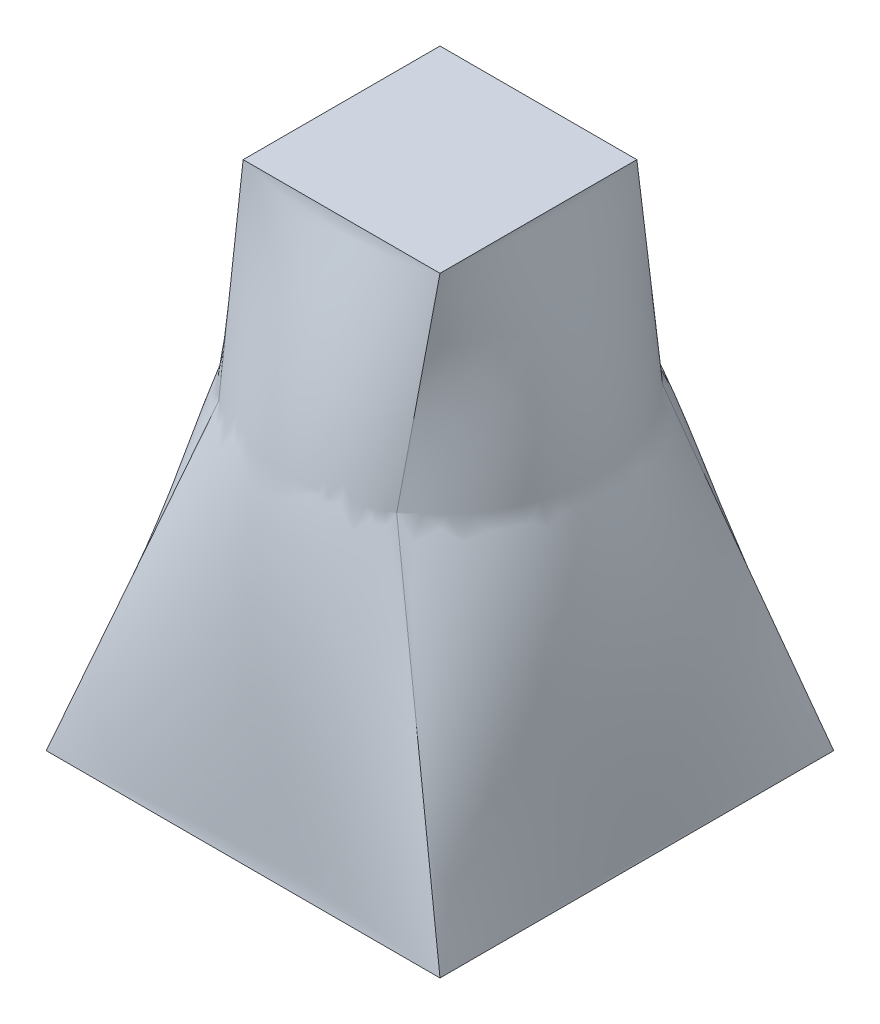
ISO-10303-21;
HEADER;
FILE_DESCRIPTION(('STEP AP214'),'2;1');
FILE_NAME('part.step','',(''),(''),'','','');
FILE_SCHEMA(('AUTOMOTIVE_DESIGN { 1 0 10303 214 1 1 1 1 }'));
ENDSEC;
DATA;
#1=APPLICATION_CONTEXT('core data for automotive mechanical design processes');
#2=APPLICATION_PROTOCOL_DEFINITION('international standard','automotive_design',2000,#1);
#3=PRODUCT_CONTEXT('',#1,'mechanical');
#4=PRODUCT('Part','Part','',(#3));
#5=PRODUCT_RELATED_PRODUCT_CATEGORY('part','',(#4));
#6=PRODUCT_DEFINITION_FORMATION('','',#4);
#7=PRODUCT_DEFINITION_CONTEXT('part definition',#1,'design');
#8=PRODUCT_DEFINITION('design','',#6,#7);
#9=PRODUCT_DEFINITION_SHAPE('','',#8);
#10=(LENGTH_UNIT() NAMED_UNIT(*) SI_UNIT(.MILLI.,.METRE.));
#11=(NAMED_UNIT(*) PLANE_ANGLE_UNIT() SI_UNIT($,.RADIAN.));
#12=(NAMED_UNIT(*) SI_UNIT($,.STERADIAN.) SOLID_ANGLE_UNIT());
#13=UNCERTAINTY_MEASURE_WITH_UNIT(LENGTH_MEASURE(1.E-05),#10,'distance_accuracy_value','');
#14=(GEOMETRIC_REPRESENTATION_CONTEXT(3) GLOBAL_UNCERTAINTY_ASSIGNED_CONTEXT((#13)) GLOBAL_UNIT_ASSIGNED_CONTEXT((#10,
#11,#12)) REPRESENTATION_CONTEXT('',''));
#15=CARTESIAN_POINT('',(0.,0.,0.));
#16=DIRECTION('',(0.,0.,1.));
#17=DIRECTION('',(1.,0.,0.));
#18=AXIS2_PLACEMENT_3D('',#15,#16,#17);
#19=CARTESIAN_POINT('',(0.,0.,0.));
#20=DIRECTION('',(0.,-1.,0.));
#21=DIRECTION('',(0.,0.,-1.));
#22=AXIS2_PLACEMENT_3D('',#19,#20,#21);
#23=PLANE('',#22);
#24=DIRECTION('',(0.,0.,-1.));
#25=VECTOR('',#24,1.);
#26=CARTESIAN_POINT('',(50.,0.,50.));
#27=LINE('',#26,#25);
#28=CARTESIAN_POINT('',(50.,0.,50.));
#29=VERTEX_POINT('',#28);
#30=CARTESIAN_POINT('',(50.,0.,-50.));
#31=VERTEX_POINT('',#30);
#32=EDGE_CURVE('E149',#29,#31,#27,.T.);
#33=ORIENTED_EDGE('',*,*,#32,.F.);
#34=DIRECTION('',(1.,0.,0.));
#35=VECTOR('',#34,1.);
#36=CARTESIAN_POINT('',(-50.,0.,50.));
#37=LINE('',#36,#35);
#38=CARTESIAN_POINT('',(-50.,0.,50.));
#39=VERTEX_POINT('',#38);
#40=EDGE_CURVE('E13',#39,#29,#37,.T.);
#41=ORIENTED_EDGE('',*,*,#40,.F.);
#42=DIRECTION('',(0.,0.,1.));
#43=VECTOR('',#42,1.);
#44=CARTESIAN_POINT('',(-50.,0.,50.));
#45=LINE('',#44,#43);
#46=CARTESIAN_POINT('',(-50.,0.,-50.));
#47=VERTEX_POINT('',#46);
#48=EDGE_CURVE('E105',#47,#39,#45,.T.);
#49=ORIENTED_EDGE('',*,*,#48,.F.);
#50=DIRECTION('',(-1.,0.,0.));
#51=VECTOR('',#50,1.);
#52=CARTESIAN_POINT('',(-50.,0.,-50.));
#53=LINE('',#52,#51);
#54=EDGE_CURVE('E236',#31,#47,#53,.T.);
#55=ORIENTED_EDGE('',*,*,#54,.F.);
#56=EDGE_LOOP('',(#33,#41,#49,#55));
#57=FACE_BOUND('',#56,.T.);
#58=ADVANCED_FACE('F95',(#57),#23,.T.);
#59=CARTESIAN_POINT('',(0.,130.,0.));
#60=DIRECTION('',(0.,-1.,0.));
#61=DIRECTION('',(0.,0.,-1.));
#62=AXIS2_PLACEMENT_3D('',#59,#60,#61);
#63=PLANE('',#62);
#64=DIRECTION('',(0.,0.,-1.));
#65=VECTOR('',#64,1.);
#66=CARTESIAN_POINT('',(25.,130.,25.));
#67=LINE('',#66,#65);
#68=CARTESIAN_POINT('',(25.,130.,25.));
#69=VERTEX_POINT('',#68);
#70=CARTESIAN_POINT('',(25.,130.,-25.));
#71=VERTEX_POINT('',#70);
#72=EDGE_CURVE('E205',#69,#71,#67,.T.);
#73=ORIENTED_EDGE('',*,*,#72,.T.);
#74=DIRECTION('',(-1.,0.,0.));
#75=VECTOR('',#74,1.);
#76=CARTESIAN_POINT('',(-25.,130.,-25.));
#77=LINE('',#76,#75);
#78=CARTESIAN_POINT('',(-25.,130.,-25.));
#79=VERTEX_POINT('',#78);
#80=EDGE_CURVE('E163',#71,#79,#77,.T.);
#81=ORIENTED_EDGE('',*,*,#80,.T.);
#82=DIRECTION('',(0.,0.,1.));
#83=VECTOR('',#82,1.);
#84=CARTESIAN_POINT('',(-25.,130.,25.));
#85=LINE('',#84,#83);
#86=CARTESIAN_POINT('',(-25.,130.,25.));
#87=VERTEX_POINT('',#86);
#88=EDGE_CURVE('E144',#79,#87,#85,.T.);
#89=ORIENTED_EDGE('',*,*,#88,.T.);
#90=DIRECTION('',(1.,0.,0.));
#91=VECTOR('',#90,1.);
#92=CARTESIAN_POINT('',(-25.,130.,25.));
#93=LINE('',#92,#91);
#94=EDGE_CURVE('E151',#87,#69,#93,.T.);
#95=ORIENTED_EDGE('',*,*,#94,.T.);
#96=EDGE_LOOP('',(#73,#81,#89,#95));
#97=FACE_BOUND('',#96,.T.);
#98=ADVANCED_FACE('F162',(#97),#63,.F.);
#99=CARTESIAN_POINT('',(-25.,130.,-25.));
#100=CARTESIAN_POINT('',(-28.0166042683851,113.664252779284,-23.5919860350599));
#101=CARTESIAN_POINT('',(-31.0778100362192,97.0870469419716,-22.163636841461));
#102=CARTESIAN_POINT('',(-34.1511796455153,80.4439774885708,-20.7296574906513));
#103=CARTESIAN_POINT('',(-34.2120123463284,80.11540517951,-20.7070794599427));
#104=CARTESIAN_POINT('',(-34.2284967629137,80.024696144484,-20.6895648336112));
#105=CARTESIAN_POINT('',(-34.2366285279132,79.9820326828711,-20.695119223139));
#106=CARTESIAN_POINT('',(-34.25703197565,79.8794658776715,-20.7395814181119));
#107=CARTESIAN_POINT('',(-39.5126417953677,53.2122053471702,-30.5050137605851));
#108=CARTESIAN_POINT('',(-44.7644754863173,26.5647006500737,-40.2674873293382));
#109=CARTESIAN_POINT('',(-50.,0.,-50.));
#110=CARTESIAN_POINT('',(-23.9583333333333,130.,-25.));
#111=CARTESIAN_POINT('',(-27.1076216989749,113.664479011953,-24.1259920952111));
#112=CARTESIAN_POINT('',(-30.3034720850671,97.0875034653149,-23.2395375640133));
#113=CARTESIAN_POINT('',(-33.3651373223449,80.4439898693503,-22.0251369510696));
#114=CARTESIAN_POINT('',(-33.4256290844794,80.115408969398,-22.0067106372098));
#115=CARTESIAN_POINT('',(-33.4421244169542,80.0246965581231,-21.9904558283137));
#116=CARTESIAN_POINT('',(-33.4501268156366,79.9820327795757,-21.9964510739931));
#117=CARTESIAN_POINT('',(-33.4699157785477,79.8794680806787,-22.0416307972931));
#118=CARTESIAN_POINT('',(-38.5814454653876,53.2126139639133,-32.0096138867381));
#119=CARTESIAN_POINT('',(-43.2562774470771,26.5649172826445,-41.0186563154116));
#120=CARTESIAN_POINT('',(-47.9166666666667,0.,-50.));
#121=CARTESIAN_POINT('',(-21.875,130.,-25.));
#122=CARTESIAN_POINT('',(-25.2314242719928,113.664931477289,-25.1487230997857));
#123=CARTESIAN_POINT('',(-28.6374706451896,97.0884165120017,-25.300107298801));
#124=CARTESIAN_POINT('',(-31.6558694956606,80.4440146309095,-24.5094229648108));
#125=CARTESIAN_POINT('',(-31.715301116851,80.1154165491741,-24.4990059489074));
#126=CARTESIAN_POINT('',(-31.7317167523513,80.0246973854014,-24.4851918266666));
#127=CARTESIAN_POINT('',(-31.7394106961709,79.982032972985,-24.4920301209101));
#128=CARTESIAN_POINT('',(-31.757846735691,79.8794724866931,-24.5385485150994));
#129=CARTESIAN_POINT('',(-36.5497093351536,53.2134311973995,-34.887133562559));
#130=CARTESIAN_POINT('',(-40.1553413157851,26.5653505477862,-42.4552563947875));
#131=CARTESIAN_POINT('',(-43.75,0.,-50.));
#132=CARTESIAN_POINT('',(-18.75,130.,-25.));
#133=CARTESIAN_POINT('',(-22.2582927896984,113.665610175294,-26.5371182103371));
#134=CARTESIAN_POINT('',(-25.8184494297418,97.0897860820315,-28.0974049210502));
#135=CARTESIAN_POINT('',(-28.7177846687277,80.4440517732478,-27.892609747184));
#136=CARTESIAN_POINT('',(-28.7745943205545,80.115427918838,-27.8932602353651));
#137=CARTESIAN_POINT('',(-28.7906134791045,80.0246986263185,-27.8828531108239));
#138=CARTESIAN_POINT('',(-28.7977091174656,79.9820332630987,-27.8908315693015));
#139=CARTESIAN_POINT('',(-28.8137776736506,79.8794790957143,-27.9390478286035));
#140=CARTESIAN_POINT('',(-33.040201119967,53.2146570476283,-38.7797034668301));
#141=CARTESIAN_POINT('',(-35.2733442877938,26.5660004454986,-44.3986311878221));
#142=CARTESIAN_POINT('',(-37.5,0.,-50.));
#143=CARTESIAN_POINT('',(-15.625,130.,-25.));
#144=CARTESIAN_POINT('',(-19.1398734516706,113.666288873299,-27.7701192448802));
#145=CARTESIAN_POINT('',(-22.7067044296911,97.0911556520617,-30.5816168982234));
#146=CARTESIAN_POINT('',(-25.4374318192941,80.4440889155865,-30.909720350408));
#147=CARTESIAN_POINT('',(-25.4906757451719,80.1154392885021,-30.9204289383994));
#148=CARTESIAN_POINT('',(-25.5060451155018,80.024699867236,-30.9131578799612));
#149=CARTESIAN_POINT('',(-25.512418392898,79.9820335532126,-30.9221438178682));
#150=CARTESIAN_POINT('',(-25.5258102047927,79.8794857047358,-30.9717271691418));
#151=CARTESIAN_POINT('',(-29.1081858995565,53.2158828978576,-42.2203767872308));
#152=CARTESIAN_POINT('',(-30.1804223007405,26.5666503432111,-46.1164090859541));
#153=CARTESIAN_POINT('',(-31.25,0.,-50.));
#154=CARTESIAN_POINT('',(-12.5,130.,-25.));
#155=CARTESIAN_POINT('',(-15.8938306766216,113.666967571303,-28.8377363445149));
#156=CARTESIAN_POINT('',(-19.3378256499432,97.0925252220915,-32.732615812994));
#157=CARTESIAN_POINT('',(-21.8564246502447,80.4441260579249,-33.5372207410738));
#158=CARTESIAN_POINT('',(-21.9052738376004,80.115450658166,-33.5569131327693));
#159=CARTESIAN_POINT('',(-21.9197709065844,80.024701108153,-33.5524897913882));
#160=CARTESIAN_POINT('',(-21.9253128504522,79.9820338433262,-33.5623419939776));
#161=CARTESIAN_POINT('',(-21.9357562577318,79.879492313757,-33.6129403995839));
#162=CARTESIAN_POINT('',(-24.8050330097244,53.2171087480864,-45.1801023319383));
#163=CARTESIAN_POINT('',(-24.9022200774751,26.5673002409235,-47.5940870836234));
#164=CARTESIAN_POINT('',(-25.,0.,-50.));
#165=CARTESIAN_POINT('',(-9.37500000000001,130.,-25.));
#166=CARTESIAN_POINT('',(-12.5301959561381,113.667646269308,-29.7305546947475));
#167=CARTESIAN_POINT('',(-15.7320243887352,97.0938947921219,-34.5314328388481));
#168=CARTESIAN_POINT('',(-17.9983952729544,80.4441632002638,-35.7529315709986));
#169=CARTESIAN_POINT('',(-18.042085871483,80.1154620278304,-35.7804723138167));
#170=CARTESIAN_POINT('',(-18.0555056160319,80.0247023490708,-35.7785919255951));
#171=CARTESIAN_POINT('',(-18.0601158192983,79.9820341334405,-35.7891611391853));
#172=CARTESIAN_POINT('',(-18.0673605147559,79.8794989227788,-35.8404025210318));
#173=CARTESIAN_POINT('',(-20.159914712989,53.218334598316,-47.6315011775286));
#174=CARTESIAN_POINT('',(-19.4533010647605,26.5679501386362,-48.8179970091052));
#175=CARTESIAN_POINT('',(-18.75,0.,-50.));
#176=CARTESIAN_POINT('',(-5.20833333333334,130.,-25.));
#177=CARTESIAN_POINT('',(-7.9210642767422,113.668551199981,-30.673669130415));
#178=CARTESIAN_POINT('',(-10.6738810502141,97.0957208854948,-36.4315790118518));
#179=CARTESIAN_POINT('',(-12.5615655401277,80.4442127233815,-38.1246015919141));
#180=CARTESIAN_POINT('',(-12.5975706908647,80.115477187382,-38.1610003336591));
#181=CARTESIAN_POINT('',(-12.6093373096441,80.0247040036267,-38.1620793613874));
#182=CARTESIAN_POINT('',(-12.6125990697743,79.9820345202585,-38.1733934214719));
#183=CARTESIAN_POINT('',(-12.615314261216,79.8795077348069,-38.224965678753));
#184=CARTESIAN_POINT('',(-13.6049932632497,53.2199690652877,-50.1808385134286));
#185=CARTESIAN_POINT('',(-12.0076415708294,26.5688166689193,-50.0908389298271));
#186=CARTESIAN_POINT('',(-10.4166666666667,0.,-50.));
#187=CARTESIAN_POINT('',(0.,130.,-25.));
#188=CARTESIAN_POINT('',(-1.92069756394995,113.669682363322,-31.3698580251672));
#189=CARTESIAN_POINT('',(-3.86976475581595,97.0980035022117,-37.8342166735386));
#190=CARTESIAN_POINT('',(-5.20260680736506,80.4442746272794,-39.9520383632215));
#191=CARTESIAN_POINT('',(-5.22745297024269,80.1154961368224,-39.9963740681884));
#192=CARTESIAN_POINT('',(-5.23673656568602,80.0247060718225,-40.0003107648782));
#193=CARTESIAN_POINT('',(-5.23810874021499,79.9820350037818,-40.0121437212558));
#194=CARTESIAN_POINT('',(-5.23465341615237,79.8795187498429,-40.0631020847051));
#195=CARTESIAN_POINT('',(-4.71645238841328,53.2220121490032,-51.9637735549037));
#196=CARTESIAN_POINT('',(-2.35366302127788,26.5698998317736,-50.9811145691179));
#197=CARTESIAN_POINT('',(0.,0.,-50.));
#198=CARTESIAN_POINT('',(5.20833333333334,130.,-25.));
#199=CARTESIAN_POINT('',(4.17439078143526,113.670813526663,-31.3398941414861));
#200=CARTESIAN_POINT('',(3.12519525801342,97.1002861189283,-37.7738126485701));
#201=CARTESIAN_POINT('',(2.37949642506661,80.4443365311768,-40.068809957092));
#202=CARTESIAN_POINT('',(2.36642454004685,80.1155150862623,-40.1163657033938));
#203=CARTESIAN_POINT('',(2.35978911634042,80.0247081400178,-40.1218940122121));
#204=CARTESIAN_POINT('',(2.36038740643749,79.9820354873047,-40.1336258319826));
#205=CARTESIAN_POINT('',(2.37021487127068,79.8795297648784,-40.1824246066704));
#206=CARTESIAN_POINT('',(4.44754546191996,53.2240552327182,-51.6350067325034));
#207=CARTESIAN_POINT('',(7.43782981930709,26.5709829946276,-50.8171813463495));
#208=CARTESIAN_POINT('',(10.4166666666667,0.,-50.));
#209=CARTESIAN_POINT('',(9.37500000000001,130.,-25.));
#210=CARTESIAN_POINT('',(8.9656595796473,113.671718457336,-30.8935936706644));
#211=CARTESIAN_POINT('',(8.55030572167626,97.1021122123016,-36.8745865839027));
#212=CARTESIAN_POINT('',(8.24540339333367,80.4443860542948,-39.1673069376576));
#213=CARTESIAN_POINT('',(8.24120007705159,80.1155302458142,-39.2146953623516));
#214=CARTESIAN_POINT('',(8.23653533755503,80.0247097945741,-39.2207606241229));
#215=CARTESIAN_POINT('',(8.23863759041092,79.9820358741231,-39.2320509244053));
#216=CARTESIAN_POINT('',(8.25338225786748,79.8795385769068,-39.2782230542373));
#217=CARTESIAN_POINT('',(11.5321340901212,53.2256896996902,-50.1438306463382));
#218=CARTESIAN_POINT('',(15.1479110306351,26.5718495249109,-50.0729084793842));
#219=CARTESIAN_POINT('',(18.75,0.,-50.));
#220=CARTESIAN_POINT('',(12.5,130.,-25.));
#221=CARTESIAN_POINT('',(12.5165980915677,113.672397155341,-30.3556189796041));
#222=CARTESIAN_POINT('',(12.5334838422444,97.1034817823318,-35.79066332898));
#223=CARTESIAN_POINT('',(12.5446816140207,80.4444231966336,-38.0123664328323));
#224=CARTESIAN_POINT('',(12.5468535690319,80.1155416154785,-38.0583091052415));
#225=CARTESIAN_POINT('',(12.543592720572,80.0247110354916,-38.0644227138579));
#226=CARTESIAN_POINT('',(12.5467866452675,79.9820361642371,-38.0752083280197));
#227=CARTESIAN_POINT('',(12.5651287209766,79.8795451859284,-38.1189778359546));
#228=CARTESIAN_POINT('',(16.7219446020975,53.2269155499195,-48.4343856284144));
#229=CARTESIAN_POINT('',(20.868752595593,26.5724994226235,-49.2196319660043));
#230=CARTESIAN_POINT('',(25.,0.,-50.));
#231=CARTESIAN_POINT('',(15.625,130.,-25.));
#232=CARTESIAN_POINT('',(15.9989705727971,113.673075853346,-29.6184826070773));
#233=CARTESIAN_POINT('',(16.378516156353,97.1048513523616,-34.3054721163713));
#234=CARTESIAN_POINT('',(16.6824325025239,80.4444603389719,-36.3882423577123));
#235=CARTESIAN_POINT('',(16.6905343396203,80.1155529851423,-36.4314455692368));
#236=CARTESIAN_POINT('',(16.6885578364289,80.0247122764087,-36.4372602837112));
#237=CARTESIAN_POINT('',(16.6927848871648,79.9820364543507,-36.4473711555347));
#238=CARTESIAN_POINT('',(16.714578420895,79.8795517949496,-36.4883141043372));
#239=CARTESIAN_POINT('',(21.7123604149015,53.2281414001483,-46.1457648413461));
#240=CARTESIAN_POINT('',(26.490051861275,26.5731493203358,-48.0772179380126));
#241=CARTESIAN_POINT('',(31.25,0.,-50.));
#242=CARTESIAN_POINT('',(18.75,130.,-25.));
#243=CARTESIAN_POINT('',(19.400577961085,113.67375455135,-28.6886674820869));
#244=CARTESIAN_POINT('',(20.0608241770216,97.1062209223917,-32.4320746538395));
#245=CARTESIAN_POINT('',(20.6299176010296,80.4444974813106,-34.3102071470011));
#246=CARTESIAN_POINT('',(20.6434246886931,80.1155643548065,-34.3494193006607));
#247=CARTESIAN_POINT('',(20.6425917157781,80.0247135173261,-34.3545991830771));
#248=CARTESIAN_POINT('',(20.6477829304621,79.9820367444647,-34.363870791859));
#249=CARTESIAN_POINT('',(20.6728560049553,79.8795584039711,-34.4015770439113));
#250=CARTESIAN_POINT('',(26.4679058225153,53.2293672503776,-43.2968210853507));
#251=CARTESIAN_POINT('',(31.994098560758,26.5737992180484,-46.6550781354865));
#252=CARTESIAN_POINT('',(37.5,0.,-50.));
#253=CARTESIAN_POINT('',(21.875,130.,-25.));
#254=CARTESIAN_POINT('',(22.7018162020467,113.674433249355,-27.5712971779671));
#255=CARTESIAN_POINT('',(23.540909950591,97.1075904924218,-30.1807938398089));
#256=CARTESIAN_POINT('',(24.3409538277285,80.4445346236492,-31.7903308756842));
#257=CARTESIAN_POINT('',(24.3592141910002,80.1155757244706,-31.8243336560558));
#258=CARTESIAN_POINT('',(24.3593497534452,80.0247147582434,-31.828551701515));
#259=CARTESIAN_POINT('',(24.3654194308649,79.9820370345786,-31.8368239013671));
#260=CARTESIAN_POINT('',(24.3935583995075,79.8795650129926,-31.8708942251329));
#261=CARTESIAN_POINT('',(30.9315708961565,53.2305931006068,-39.9024540615385));
#262=CARTESIAN_POINT('',(37.3524320608549,26.5744491157609,-44.9606508228995));
#263=CARTESIAN_POINT('',(43.75,0.,-50.));
#264=CARTESIAN_POINT('',(23.9583333333333,130.,-25.));
#265=CARTESIAN_POINT('',(24.8253253176916,113.674885714692,-26.7052586975733));
#266=CARTESIAN_POINT('',(25.7051912578146,97.1085035391084,-28.4358992493711));
#267=CARTESIAN_POINT('',(26.6328366444448,80.4445593852082,-29.8250681414163));
#268=CARTESIAN_POINT('',(26.6537636286629,80.1155833042465,-29.8548112064075));
#269=CARTESIAN_POINT('',(26.6544100792347,80.0247155855216,-29.8581768443096));
#270=CARTESIAN_POINT('',(26.6609993811059,79.9820372279877,-29.865679347782));
#271=CARTESIAN_POINT('',(26.6910177028863,79.8795694190068,-29.8970678917785));
#272=CARTESIAN_POINT('',(33.6825063043086,53.2314103340928,-37.2873031034408));
#273=CARTESIAN_POINT('',(40.8124085781683,26.5748823809025,-43.6551867133362));
#274=CARTESIAN_POINT('',(47.9166666666666,0.,-50.));
#275=CARTESIAN_POINT('',(25.,130.,-25.));
#276=CARTESIAN_POINT('',(25.864775187184,113.67511194736,-26.2428662307051));
#277=CARTESIAN_POINT('',(26.7423927611485,97.1089600624517,-27.5042712192325));
#278=CARTESIAN_POINT('',(27.7262328381415,80.4445717659877,-28.7732395509048));
#279=CARTESIAN_POINT('',(27.7483482466935,80.1155870941346,-28.8006619564627));
#280=CARTESIAN_POINT('',(27.7492112528139,80.0247159991607,-28.8035501779828));
#281=CARTESIAN_POINT('',(27.756041321827,79.9820373246923,-28.8106427526385));
#282=CARTESIAN_POINT('',(27.7869518422285,79.8795716220139,-28.8406278826522));
#283=CARTESIAN_POINT('',(34.9931104516806,53.2318189508358,-35.8943082755277));
#284=CARTESIAN_POINT('',(42.5100154966974,26.5750990134733,-42.9598114066332));
#285=CARTESIAN_POINT('',(50.,0.,-50.));
#286=B_SPLINE_SURFACE_WITH_KNOTS('',3,3,((#99,#100,#101,#102,#103,#104,#105,#106,#107,#108,
#109),(#110,#111,#112,#113,#114,#115,#116,#117,#118,#119,#120),(#121,#122,#123,#124,#125,#126,
#127,#128,#129,#130,#131),(#132,#133,#134,#135,#136,#137,#138,#139,#140,#141,#142),(#143,#144,
#145,#146,#147,#148,#149,#150,#151,#152,#153),(#154,#155,#156,#157,#158,#159,#160,#161,#162,
#163,#164),(#165,#166,#167,#168,#169,#170,#171,#172,#173,#174,#175),(#176,#177,#178,#179,#180,
#181,#182,#183,#184,#185,#186),(#187,#188,#189,#190,#191,#192,#193,#194,#195,#196,#197),(#198,
#199,#200,#201,#202,#203,#204,#205,#206,#207,#208),(#209,#210,#211,#212,#213,#214,#215,#216,
#217,#218,#219),(#220,#221,#222,#223,#224,#225,#226,#227,#228,#229,#230),(#231,#232,#233,#234,
#235,#236,#237,#238,#239,#240,#241),(#242,#243,#244,#245,#246,#247,#248,#249,#250,#251,#252),
(#253,#254,#255,#256,#257,#258,#259,#260,#261,#262,#263),(#264,#265,#266,#267,#268,#269,#270,
#271,#272,#273,#274),(#275,#276,#277,#278,#279,#280,#281,#282,#283,#284,#285)),.UNSPECIFIED.,
.F.,.F.,.F.,(4,1,1,1,1,1,1,1,1,1,1,1,1,1,4),(4,1,1,1,1,1,1,1,4),(0.,0.0625,0.125,0.1875,0.25,
0.3125,0.375,0.5,0.625,0.6875,0.75,0.8125,0.875,0.9375,1.),(0.,0.36328125,0.36865234375,
0.3701171875,0.37060546875,0.370640376481953,0.37109375,0.373046875,1.),.UNSPECIFIED.);
#287=CARTESIAN_POINT('',(25.,130.,-25.));
#288=CARTESIAN_POINT('',(25.864775187184,113.67511194736,-26.2428662307051));
#289=CARTESIAN_POINT('',(26.7423927611485,97.1089600624517,-27.5042712192325));
#290=CARTESIAN_POINT('',(27.7262328381415,80.4445717659877,-28.7732395509048));
#291=CARTESIAN_POINT('',(27.7483482466935,80.1155870941346,-28.8006619564627));
#292=CARTESIAN_POINT('',(27.7492112528139,80.0247159991607,-28.8035501779828));
#293=CARTESIAN_POINT('',(27.756041321827,79.9820373246923,-28.8106427526385));
#294=CARTESIAN_POINT('',(27.7869518422285,79.8795716220139,-28.8406278826522));
#295=CARTESIAN_POINT('',(34.9931104516806,53.2318189508358,-35.8943082755277));
#296=CARTESIAN_POINT('',(42.5100154966974,26.5750990134733,-42.9598114066332));
#297=CARTESIAN_POINT('',(50.,0.,-50.));
#298=B_SPLINE_CURVE_WITH_KNOTS('',3,(#287,#288,#289,#290,#291,#292,#293,#294,#295,#296,#297),
.UNSPECIFIED.,.F.,.F.,(4,1,1,1,1,1,1,1,4),(0.,0.36328125,0.36865234375,0.3701171875,
0.37060546875,0.370640376481953,0.37109375,0.373046875,1.),.UNSPECIFIED.);
#299=EDGE_CURVE('E244',#71,#31,#298,.T.);
#300=CARTESIAN_POINT('',(-25.,130.,-25.));
#301=CARTESIAN_POINT('',(-28.0166042683851,113.664252779284,-23.5919860350599));
#302=CARTESIAN_POINT('',(-31.0778100362192,97.0870469419716,-22.163636841461));
#303=CARTESIAN_POINT('',(-34.1511796455153,80.4439774885708,-20.7296574906513));
#304=CARTESIAN_POINT('',(-34.2120123463284,80.11540517951,-20.7070794599427));
#305=CARTESIAN_POINT('',(-34.2284967629137,80.024696144484,-20.6895648336112));
#306=CARTESIAN_POINT('',(-34.2366285279132,79.9820326828711,-20.695119223139));
#307=CARTESIAN_POINT('',(-34.25703197565,79.8794658776715,-20.7395814181119));
#308=CARTESIAN_POINT('',(-39.5126417953677,53.2122053471702,-30.5050137605851));
#309=CARTESIAN_POINT('',(-44.7644754863173,26.5647006500737,-40.2674873293382));
#310=CARTESIAN_POINT('',(-50.,0.,-50.));
#311=B_SPLINE_CURVE_WITH_KNOTS('',3,(#300,#301,#302,#303,#304,#305,#306,#307,#308,#309,#310),
.UNSPECIFIED.,.F.,.F.,(4,1,1,1,1,1,1,1,4),(0.,0.36328125,0.36865234375,0.3701171875,
0.37060546875,0.370640376481953,0.37109375,0.373046875,1.),.UNSPECIFIED.);
#312=EDGE_CURVE('E157',#47,#79,#311,.F.);
#313=ORIENTED_EDGE('',*,*,#80,.F.);
#314=ORIENTED_EDGE('',*,*,#299,.T.);
#315=ORIENTED_EDGE('',*,*,#54,.T.);
#316=ORIENTED_EDGE('',*,*,#312,.T.);
#317=EDGE_LOOP('',(#313,#314,#315,#316));
#318=FACE_BOUND('',#317,.T.);
#319=ADVANCED_FACE('F182',(#318),#286,.T.);
#320=CARTESIAN_POINT('',(25.,130.,-25.));
#321=CARTESIAN_POINT('',(25.864775187184,113.67511194736,-26.2428662307051));
#322=CARTESIAN_POINT('',(26.7423927611485,97.1089600624517,-27.5042712192325));
#323=CARTESIAN_POINT('',(27.7262328381415,80.4445717659877,-28.7732395509048));
#324=CARTESIAN_POINT('',(27.7483482466935,80.1155870941346,-28.8006619564627));
#325=CARTESIAN_POINT('',(27.7487437342992,80.0245591148614,-28.8031366502618));
#326=CARTESIAN_POINT('',(27.756041321827,79.9820373246923,-28.8106427526385));
#327=CARTESIAN_POINT('',(27.7869518422285,79.8795716220139,-28.8406278826522));
#328=CARTESIAN_POINT('',(34.9931104516806,53.2318189508358,-35.8943082755277));
#329=CARTESIAN_POINT('',(42.5100154966974,26.5750990134733,-42.9598114066332));
#330=CARTESIAN_POINT('',(50.,0.,-50.));
#331=CARTESIAN_POINT('',(25.,130.,-23.9583333333333));
#332=CARTESIAN_POINT('',(26.3372895020058,113.67506499798,-25.2220669483101));
#333=CARTESIAN_POINT('',(27.6944165977528,97.1088655480201,-26.5046436740549));
#334=CARTESIAN_POINT('',(28.8122919691163,80.444568712561,-27.7250082365256));
#335=CARTESIAN_POINT('',(28.8369864464579,80.1155864373525,-27.7513854113602));
#336=CARTESIAN_POINT('',(28.8379584072266,80.0245591148614,-27.7536972154602));
#337=CARTESIAN_POINT('',(28.8456793913565,79.9820372969749,-27.7609677003905));
#338=CARTESIAN_POINT('',(28.877898728963,79.8795713933216,-27.7900858305256));
#339=CARTESIAN_POINT('',(36.4020120800595,53.2317483641164,-34.6362021053821));
#340=CARTESIAN_POINT('',(43.2133490711966,26.5750540605838,-41.2884134595438));
#341=CARTESIAN_POINT('',(50.,0.,-47.9166666666666));
#342=CARTESIAN_POINT('',(25.,130.,-21.875));
#343=CARTESIAN_POINT('',(27.2258755264714,113.67497109922,-23.1341325028016));
#344=CARTESIAN_POINT('',(29.4847445597226,97.108676519157,-24.4120317487579));
#345=CARTESIAN_POINT('',(30.8514431722467,80.4445626057077,-25.5193878933511));
#346=CARTESIAN_POINT('',(30.8809291489508,80.1155851237886,-25.5433736194862));
#347=CARTESIAN_POINT('',(30.8829556476277,80.0245591148615,-25.5452788569761));
#348=CARTESIAN_POINT('',(30.8914752308721,79.9820372415402,-25.552038542653));
#349=CARTESIAN_POINT('',(30.9261920586832,79.879570935937,-25.579324042084));
#350=CARTESIAN_POINT('',(39.0556763868662,53.2316071906777,-31.9852418599897));
#351=CARTESIAN_POINT('',(44.5380743804839,26.5749641548048,-37.8783483934561));
#352=CARTESIAN_POINT('',(50.,0.,-43.75));
#353=CARTESIAN_POINT('',(25.,130.,-18.75));
#354=CARTESIAN_POINT('',(28.3833711694985,113.67483025108,-19.8806033252572));
#355=CARTESIAN_POINT('',(31.8168766812882,97.1083929758621,-21.0280605860633));
#356=CARTESIAN_POINT('',(33.4970031156908,80.4445534454274,-21.9244282198142));
#357=CARTESIAN_POINT('',(33.5325370911418,80.1155831534424,-21.9440367084982));
#358=CARTESIAN_POINT('',(33.5358396134486,80.0245591148614,-21.9451200369252));
#359=CARTESIAN_POINT('',(33.5454073424786,79.9820371583879,-21.9510096708421));
#360=CARTESIAN_POINT('',(33.5834970830254,79.8795702498599,-21.9752873268748));
#361=CARTESIAN_POINT('',(42.5261459625028,53.2313954305195,-27.6551003897682));
#362=CARTESIAN_POINT('',(46.2705455015717,26.5748292961362,-32.5866752829952));
#363=CARTESIAN_POINT('',(50.,0.,-37.5));
#364=CARTESIAN_POINT('',(25.,130.,-15.625));
#365=CARTESIAN_POINT('',(29.3590929175566,113.674689402941,-16.5205671865437));
#366=CARTESIAN_POINT('',(33.7827734956516,97.1081094325673,-17.4295008013358));
#367=CARTESIAN_POINT('',(35.7143415036635,80.4445442851474,-18.0785602594293));
#368=CARTESIAN_POINT('',(35.7547427163344,80.1155811830963,-18.0930996658726));
#369=CARTESIAN_POINT('',(35.7590043371161,80.0245591148614,-18.0931753889619));
#370=CARTESIAN_POINT('',(35.7694650024517,79.9820370752357,-18.0981040290718));
#371=CARTESIAN_POINT('',(35.8105407302878,79.8795695637829,-18.1191471300903));
#372=CARTESIAN_POINT('',(45.4680046394273,53.2311836703613,-23.015229403808));
#373=CARTESIAN_POINT('',(47.7391222237691,26.5746944374676,-27.1403782618779));
#374=CARTESIAN_POINT('',(50.,0.,-31.25));
#375=CARTESIAN_POINT('',(25.,130.,-12.5));
#376=CARTESIAN_POINT('',(30.1472432961967,113.674548554801,-13.0731653316638));
#377=CARTESIAN_POINT('',(35.3707543385665,97.1078258892725,-13.654917886859));
#378=CARTESIAN_POINT('',(37.4898006900722,80.4445351248674,-14.0268768111933));
#379=CARTESIAN_POINT('',(37.5338507193714,80.1155792127504,-14.0357796277431));
#380=CARTESIAN_POINT('',(37.5387444055009,80.0245591148615,-14.0346954222301));
#381=CARTESIAN_POINT('',(37.5499378474296,79.9820369920837,-14.0385884704318));
#382=CARTESIAN_POINT('',(37.5936002965559,79.879568877706,-14.0562110490357));
#383=CARTESIAN_POINT('',(47.8643929660704,53.2309719102033,-18.1212929496064));
#384=CARTESIAN_POINT('',(48.9353879312847,26.5745595787992,-21.5672460692123));
#385=CARTESIAN_POINT('',(50.,0.,-25.));
#386=CARTESIAN_POINT('',(25.,130.,-9.375));
#387=CARTESIAN_POINT('',(30.7409483586624,113.674407706661,-9.55007931247104));
#388=CARTESIAN_POINT('',(36.5669696855871,97.1075423459776,-9.72784765745617));
#389=CARTESIAN_POINT('',(38.8071870835724,80.4445259645871,-9.79689718587355));
#390=CARTESIAN_POINT('',(38.8536228573271,80.1155772424042,-9.79967178555861));
#391=CARTESIAN_POINT('',(38.8588095908617,80.0245591148614,-9.79729569511634));
#392=CARTESIAN_POINT('',(38.8705697802819,79.9820369089314,-9.80008852772017));
#393=CARTESIAN_POINT('',(38.9164050527581,79.8795681916288,-9.81412948195878));
#394=CARTESIAN_POINT('',(49.6953210358885,53.2307601500451,-13.0072617776098));
#395=CARTESIAN_POINT('',(49.8493632150977,26.5744247201306,-15.8842376643972));
#396=CARTESIAN_POINT('',(50.,0.,-18.75));
#397=CARTESIAN_POINT('',(25.,130.,-5.20833333333333));
#398=CARTESIAN_POINT('',(31.2665871753864,113.674219909142,-4.78604299140603));
#399=CARTESIAN_POINT('',(37.6260552935605,97.1071642882513,-4.35759292293452));
#400=CARTESIAN_POINT('',(39.9371370462036,80.4445137508805,-4.00005615346953));
#401=CARTESIAN_POINT('',(39.9850261458779,80.1155746152763,-3.99422725504128));
#402=CARTESIAN_POINT('',(39.990139890728,80.0245591148615,-3.99001255379908));
#403=CARTESIAN_POINT('',(40.0024286440582,79.982036798062,-3.99128157518222));
#404=CARTESIAN_POINT('',(40.0505948727481,79.8795672768596,-4.00040528985971));
#405=CARTESIAN_POINT('',(51.3631055512801,53.2304778031678,-5.99491023816456));
#406=CARTESIAN_POINT('',(50.6818719121649,26.5742449085726,-8.21022204758711));
#407=CARTESIAN_POINT('',(50.,0.,-10.4166666666667));
#408=CARTESIAN_POINT('',(25.,130.,0.));
#409=CARTESIAN_POINT('',(31.4054977808152,113.673985162242,1.2954189772697));
#410=CARTESIAN_POINT('',(37.9059758313516,97.106691716093,2.60992769205807));
#411=CARTESIAN_POINT('',(40.1289491497871,80.4444984837467,3.54380632227102));
#412=CARTESIAN_POINT('',(40.17528920181,80.1155713313659,3.56121076636551));
#413=CARTESIAN_POINT('',(40.1794083305963,80.0245591148612,3.56794414004033));
#414=CARTESIAN_POINT('',(40.19191537151,79.9820366594747,3.56868782474872));
#415=CARTESIAN_POINT('',(40.2418923827293,79.8795661333976,3.56597975089429));
#416=CARTESIAN_POINT('',(51.9410557570887,53.2301248695705,3.13815719613464));
#417=CARTESIAN_POINT('',(50.9702892442511,26.5740201441248,1.56582560905169));
#418=CARTESIAN_POINT('',(50.,0.,0.));
#419=CARTESIAN_POINT('',(25.,130.,5.20833333333334));
#420=CARTESIAN_POINT('',(30.8222668250138,113.673750415343,7.31240139121123));
#421=CARTESIAN_POINT('',(36.7309364225243,97.1062191439354,9.44753587083214));
#422=CARTESIAN_POINT('',(38.619545670829,80.4444832166136,10.9357683547214));
#423=CARTESIAN_POINT('',(38.6596458092605,80.1155680474563,10.9643295000846));
#424=CARTESIAN_POINT('',(38.6615112587596,80.0245591148617,10.973469125248));
#425=CARTESIAN_POINT('',(38.6736199793749,79.9820365208882,10.9761704595274));
#426=CARTESIAN_POINT('',(38.7238706165046,79.8795649899364,10.9797407747719));
#427=CARTESIAN_POINT('',(50.4189689925481,53.2297719359742,12.0837136823826));
#428=CARTESIAN_POINT('',(50.2103210903621,26.5737953796775,11.2482636011113));
#429=CARTESIAN_POINT('',(50.,0.,10.4166666666667));
#430=CARTESIAN_POINT('',(25.,130.,9.37500000000001));
#431=CARTESIAN_POINT('',(29.9654050553395,113.673562617823,11.9538757944821));
#432=CARTESIAN_POINT('',(35.0045806608593,97.1058410862086,14.5708546984003));
#433=CARTESIAN_POINT('',(36.4926112956487,80.4444710029064,16.4438789559031));
#434=CARTESIAN_POINT('',(36.5251843533023,80.1155654203278,16.4802474652743));
#435=CARTESIAN_POINT('',(36.5245664063272,80.0245591148612,16.4910120129367));
#436=CARTESIAN_POINT('',(36.5360232287325,79.9820364100182,16.4951325077027));
#437=CARTESIAN_POINT('',(36.5856620196654,79.8795640751666,16.5033591761762));
#438=CARTESIAN_POINT('',(48.0663474008326,53.2294895890961,18.7396467959363));
#439=CARTESIAN_POINT('',(49.0357530216728,26.5736155681192,18.7443471577173));
#440=CARTESIAN_POINT('',(50.,0.,18.75));
#441=CARTESIAN_POINT('',(25.,130.,12.5));
#442=CARTESIAN_POINT('',(29.1352265014053,113.673421769683,15.350478551267));
#443=CARTESIAN_POINT('',(33.3319767323645,97.1055575429141,18.2430883547528));
#444=CARTESIAN_POINT('',(34.4556235248667,80.4444618426267,20.3758902762656));
#445=CARTESIAN_POINT('',(34.4813331056077,80.1155634499821,20.4175653962411));
#446=CARTESIAN_POINT('',(34.4785256463957,80.0245591148616,20.4294013036164));
#447=CARTESIAN_POINT('',(34.4893334188534,79.9820363268664,20.4345140149663));
#448=CARTESIAN_POINT('',(34.5381141424591,79.87956338909,20.4460530744658));
#449=CARTESIAN_POINT('',(45.756524686524,53.2292778289384,23.4858560041417));
#450=CARTESIAN_POINT('',(47.8825727818394,26.5734807094508,24.2437306008264));
#451=CARTESIAN_POINT('',(50.,0.,25.));
#452=CARTESIAN_POINT('',(25.,130.,15.625));
#453=CARTESIAN_POINT('',(28.1269884547361,113.673280921544,18.6383773725123));
#454=CARTESIAN_POINT('',(31.3006212183726,97.105273999619,21.6963069581834));
#455=CARTESIAN_POINT('',(31.9991645590683,80.4444526823463,24.0518176943132));
#456=CARTESIAN_POINT('',(32.0168540292744,80.1155614796357,24.0980933090618));
#457=CARTESIAN_POINT('',(32.0115466087793,80.0245591148613,24.1108110494215));
#458=CARTESIAN_POINT('',(32.0215532933892,79.9820362437139,24.1168231593997));
#459=CARTESIAN_POINT('',(32.0690969307293,79.8795627030127,24.1314432218109));
#460=CARTESIAN_POINT('',(42.9288928088317,53.2290660687799,27.9159467451218));
#461=CARTESIAN_POINT('',(46.4708906112964,26.5733458507821,29.5853006256162));
#462=CARTESIAN_POINT('',(50.,0.,31.25));
#463=CARTESIAN_POINT('',(25.,130.,18.75));
#464=CARTESIAN_POINT('',(26.9495027744903,113.673140073404,21.8071993231379));
#465=CARTESIAN_POINT('',(28.9282681200647,97.1049904563243,24.9096112752446));
#466=CARTESIAN_POINT('',(29.1439933088555,80.4444435220664,27.4472247286935));
#467=CARTESIAN_POINT('',(29.1525632747203,80.1155595092898,27.4973273421769));
#468=CARTESIAN_POINT('',(29.1444608074872,80.0245591148615,27.5107193034454));
#469=CARTESIAN_POINT('',(29.1535218904441,79.9820361605619,27.5175291370605));
#470=CARTESIAN_POINT('',(29.1994681795782,79.8795620169358,27.5349767343522));
#471=CARTESIAN_POINT('',(39.6090772558926,53.228854308622,31.9997538153647));
#472=CARTESIAN_POINT('',(44.8134993276054,26.5732109921136,34.7539980869432));
#473=CARTESIAN_POINT('',(50.,0.,37.5));
#474=CARTESIAN_POINT('',(25.,130.,21.875));
#475=CARTESIAN_POINT('',(25.6118589004493,113.672999225264,24.8391636680464));
#476=CARTESIAN_POINT('',(26.2332307038814,97.1047069130295,27.8471769485292));
#477=CARTESIAN_POINT('',(25.9115226071445,80.4444343617863,30.5202236592686));
#478=CARTESIAN_POINT('',(25.9099327177773,80.1155575389438,30.5732642758719));
#479=CARTESIAN_POINT('',(25.8987559659082,80.0245591148615,30.58709184503));
#480=CARTESIAN_POINT('',(25.9067346945172,79.9820360774097,30.5945825450301));
#481=CARTESIAN_POINT('',(25.9507427213629,79.8795613308588,30.6145663609482));
#482=CARTESIAN_POINT('',(35.8235107392483,53.2286425484639,35.6855696230779));
#483=CARTESIAN_POINT('',(42.9235947323291,26.5730761334451,39.7240093969916));
#484=CARTESIAN_POINT('',(50.,0.,43.75));
#485=CARTESIAN_POINT('',(25.,130.,23.9583333333333));
#486=CARTESIAN_POINT('',(24.6192903619383,113.672905326504,26.7600491971485));
#487=CARTESIAN_POINT('',(24.2334367708216,97.1045178841662,29.6032212317655));
#488=CARTESIAN_POINT('',(23.519064237419,80.4444282549328,32.3323114391698));
#489=CARTESIAN_POINT('',(23.5100462988641,80.1155562253797,32.3866583930285));
#490=CARTESIAN_POINT('',(23.4966442674065,80.0245591148614,32.4006012768339));
#491=CARTESIAN_POINT('',(23.5038153522644,79.9820360219749,32.4084601396792));
#492=CARTESIAN_POINT('',(23.5463166278433,79.8795608734741,32.4299210045687));
#493=CARTESIAN_POINT('',(33.0066491252615,53.2285013750251,37.85074021289));
#494=CARTESIAN_POINT('',(41.5173109894006,26.5729862276661,42.891557387743));
#495=CARTESIAN_POINT('',(50.,0.,47.9166666666667));
#496=CARTESIAN_POINT('',(25.,130.,25.));
#497=CARTESIAN_POINT('',(24.0993090748253,113.672858377124,27.6927144669028));
#498=CARTESIAN_POINT('',(23.1857954094417,97.1044233697346,30.4252776950229));
#499=CARTESIAN_POINT('',(22.2670097986127,80.4444252015061,33.1729173187228));
#500=CARTESIAN_POINT('',(22.2541239050713,80.1155555685977,33.2277370049745));
#501=CARTESIAN_POINT('',(22.2395679177601,80.0245591148614,33.2416891156794));
#502=CARTESIAN_POINT('',(22.2463149468039,79.9820359942575,33.2497083418522));
#503=CARTESIAN_POINT('',(22.2880124050772,79.8795606447818,33.2718486038177));
#504=CARTESIAN_POINT('',(31.5293057722252,53.2284307883058,38.8525466561849));
#505=CARTESIAN_POINT('',(40.7797664316537,26.5729412747765,44.4350047713502));
#506=CARTESIAN_POINT('',(50.,0.,50.));
#507=B_SPLINE_SURFACE_WITH_KNOTS('',3,3,((#320,#321,#322,#323,#324,#325,#326,#327,#328,#329,
#330),(#331,#332,#333,#334,#335,#336,#337,#338,#339,#340,#341),(#342,#343,#344,#345,#346,#347,
#348,#349,#350,#351,#352),(#353,#354,#355,#356,#357,#358,#359,#360,#361,#362,#363),(#364,#365,
#366,#367,#368,#369,#370,#371,#372,#373,#374),(#375,#376,#377,#378,#379,#380,#381,#382,#383,
#384,#385),(#386,#387,#388,#389,#390,#391,#392,#393,#394,#395,#396),(#397,#398,#399,#400,#401,
#402,#403,#404,#405,#406,#407),(#408,#409,#410,#411,#412,#413,#414,#415,#416,#417,#418),(#419,
#420,#421,#422,#423,#424,#425,#426,#427,#428,#429),(#430,#431,#432,#433,#434,#435,#436,#437,
#438,#439,#440),(#441,#442,#443,#444,#445,#446,#447,#448,#449,#450,#451),(#452,#453,#454,#455,
#456,#457,#458,#459,#460,#461,#462),(#463,#464,#465,#466,#467,#468,#469,#470,#471,#472,#473),
(#474,#475,#476,#477,#478,#479,#480,#481,#482,#483,#484),(#485,#486,#487,#488,#489,#490,#491,
#492,#493,#494,#495),(#496,#497,#498,#499,#500,#501,#502,#503,#504,#505,#506)),.UNSPECIFIED.,
.F.,.F.,.F.,(4,1,1,1,1,1,1,1,1,1,1,1,1,1,4),(4,1,1,1,1,1,1,1,4),(0.,0.0625,0.125,0.1875,0.25,
0.3125,0.375,0.5,0.625,0.6875,0.75,0.8125,0.875,0.9375,1.),(0.,0.36328125,0.36865234375,
0.3701171875,0.37060546875,0.370640376481953,0.37109375,0.373046875,1.),.UNSPECIFIED.);
#508=CARTESIAN_POINT('',(25.,130.,25.));
#509=CARTESIAN_POINT('',(24.0993090748253,113.672858377124,27.6927144669028));
#510=CARTESIAN_POINT('',(23.1857954094417,97.1044233697346,30.4252776950229));
#511=CARTESIAN_POINT('',(22.2670097986127,80.4444252015061,33.1729173187228));
#512=CARTESIAN_POINT('',(22.2541239050713,80.1155555685977,33.2277370049745));
#513=CARTESIAN_POINT('',(22.2395679177601,80.0245591148614,33.2416891156794));
#514=CARTESIAN_POINT('',(22.2463149468039,79.9820359942575,33.2497083418522));
#515=CARTESIAN_POINT('',(22.2880124050772,79.8795606447818,33.2718486038177));
#516=CARTESIAN_POINT('',(31.5293057722252,53.2284307883058,38.8525466561849));
#517=CARTESIAN_POINT('',(40.7797664316537,26.5729412747765,44.4350047713502));
#518=CARTESIAN_POINT('',(50.,0.,50.));
#519=B_SPLINE_CURVE_WITH_KNOTS('',3,(#508,#509,#510,#511,#512,#513,#514,#515,#516,#517,#518),
.UNSPECIFIED.,.F.,.F.,(4,1,1,1,1,1,1,1,4),(0.,0.36328125,0.36865234375,0.3701171875,
0.37060546875,0.370640376481953,0.37109375,0.373046875,1.),.UNSPECIFIED.);
#520=EDGE_CURVE('E113',#69,#29,#519,.T.);
#521=ORIENTED_EDGE('',*,*,#72,.F.);
#522=ORIENTED_EDGE('',*,*,#520,.T.);
#523=ORIENTED_EDGE('',*,*,#32,.T.);
#524=ORIENTED_EDGE('',*,*,#299,.F.);
#525=EDGE_LOOP('',(#521,#522,#523,#524));
#526=FACE_BOUND('',#525,.T.);
#527=ADVANCED_FACE('F243',(#526),#507,.T.);
#528=CARTESIAN_POINT('',(-25.,130.,25.));
#529=CARTESIAN_POINT('',(-24.9926655374575,113.684251281216,27.0371753900082));
#530=CARTESIAN_POINT('',(-24.9854303009907,97.1274589778398,29.1045199850904));
#531=CARTESIAN_POINT('',(-24.9784224280348,80.4450700450966,31.1876458195126));
#532=CARTESIAN_POINT('',(-24.9822534902446,80.115750221954,31.2301568503599));
#533=CARTESIAN_POINT('',(-24.9754838353603,80.0247294501536,31.2391671813542));
#534=CARTESIAN_POINT('',(-24.9818379679961,79.9820392785926,31.2467275607986));
#535=CARTESIAN_POINT('',(-25.0186275435972,79.879678676328,31.2723974980668));
#536=CARTESIAN_POINT('',(-33.339680900025,53.2495591236408,37.5132524743926));
#537=CARTESIAN_POINT('',(-41.6850783635289,26.5838486183189,43.7670752333804));
#538=CARTESIAN_POINT('',(-50.,0.,50.));
#539=CARTESIAN_POINT('',(-25.,130.,8.33333333333334));
#540=CARTESIAN_POINT('',(-31.3241689660599,113.677585113905,12.1829116742168));
#541=CARTESIAN_POINT('',(-37.7419792632553,97.113988299217,16.0892782141714));
#542=CARTESIAN_POINT('',(-40.5771250570608,80.444705859588,18.6455809944864));
#543=CARTESIAN_POINT('',(-40.6345370553257,80.115635207806,18.6945829419031));
#544=CARTESIAN_POINT('',(-40.644800390812,80.0247183482637,18.7099536365561));
#545=CARTESIAN_POINT('',(-40.6562926122971,79.9820370800188,18.7148690368993));
#546=CARTESIAN_POINT('',(-40.6989518430544,79.8796077434425,18.721465905736));
#547=CARTESIAN_POINT('',(-50.8785054007234,53.2371078648173,20.7209700627374));
#548=CARTESIAN_POINT('',(-50.4400912700714,26.5774659622371,18.6912181940729));
#549=CARTESIAN_POINT('',(-50.,0.,16.6666666666667));
#550=CARTESIAN_POINT('',(-25.,130.,-8.33333333333333));
#551=CARTESIAN_POINT('',(-32.702960998707,113.670918946595,-6.77410844637449));
#552=CARTESIAN_POINT('',(-40.5198798618948,97.1005176205943,-5.19213539921399));
#553=CARTESIAN_POINT('',(-44.5082679512941,80.4443416740794,-3.56172607934097));
#554=CARTESIAN_POINT('',(-44.5870892084168,80.115520193658,-3.53288377988844));
#555=CARTESIAN_POINT('',(-44.6057504174088,80.0247072463739,-3.51830593083753));
#556=CARTESIAN_POINT('',(-44.6181518049838,79.9820348814449,-3.51953868968202));
#557=CARTESIAN_POINT('',(-44.6561383076409,79.879536810557,-3.5407480511693));
#558=CARTESIAN_POINT('',(-54.0145069739369,53.2246566059938,-8.00240812429345));
#559=CARTESIAN_POINT('',(-52.004892419658,26.5710833061554,-12.3409090534703));
#560=CARTESIAN_POINT('',(-50.,0.,-16.6666666666666));
#561=CARTESIAN_POINT('',(-25.,130.,-25.));
#562=CARTESIAN_POINT('',(-28.0166042683851,113.664252779284,-23.5919860350599));
#563=CARTESIAN_POINT('',(-31.0778100362192,97.0870469419716,-22.163636841461));
#564=CARTESIAN_POINT('',(-34.1511796455153,80.4439774885708,-20.7296574906513));
#565=CARTESIAN_POINT('',(-34.2120123463284,80.11540517951,-20.7070794599427));
#566=CARTESIAN_POINT('',(-34.2284967629137,80.024696144484,-20.6895648336112));
#567=CARTESIAN_POINT('',(-34.2366285279132,79.9820326828711,-20.695119223139));
#568=CARTESIAN_POINT('',(-34.25703197565,79.8794658776715,-20.7395814181119));
#569=CARTESIAN_POINT('',(-39.5126417953677,53.2122053471702,-30.5050137605851));
#570=CARTESIAN_POINT('',(-44.7644754863173,26.5647006500737,-40.2674873293382));
#571=CARTESIAN_POINT('',(-50.,0.,-50.));
#572=B_SPLINE_SURFACE_WITH_KNOTS('',3,3,((#528,#529,#530,#531,#532,#533,#534,#535,#536,#537,
#538),(#539,#540,#541,#542,#543,#544,#545,#546,#547,#548,#549),(#550,#551,#552,#553,#554,#555,
#556,#557,#558,#559,#560),(#561,#562,#563,#564,#565,#566,#567,#568,#569,#570,#571)),
.UNSPECIFIED.,.F.,.F.,.F.,(4,4),(4,1,1,1,1,1,1,1,4),(0.,1.),(0.,0.36328125,0.36865234375,
0.3701171875,0.37060546875,0.370640376481953,0.37109375,0.373046875,1.),.UNSPECIFIED.);
#573=CARTESIAN_POINT('',(-25.,130.,25.));
#574=CARTESIAN_POINT('',(-24.9926655374575,113.684251281216,27.0371753900082));
#575=CARTESIAN_POINT('',(-24.9854303009907,97.1274589778398,29.1045199850904));
#576=CARTESIAN_POINT('',(-24.9784224280348,80.4450700450966,31.1876458195126));
#577=CARTESIAN_POINT('',(-24.9822534902446,80.115750221954,31.2301568503599));
#578=CARTESIAN_POINT('',(-24.9747894291762,80.0245591148614,31.238945494422));
#579=CARTESIAN_POINT('',(-24.9818379679961,79.9820392785926,31.2467275607986));
#580=CARTESIAN_POINT('',(-25.0186275435972,79.879678676328,31.2723974980668));
#581=CARTESIAN_POINT('',(-33.339680900025,53.2495591236408,37.5132524743926));
#582=CARTESIAN_POINT('',(-41.6850783635289,26.5838486183189,43.7670752333804));
#583=CARTESIAN_POINT('',(-50.,0.,50.));
#584=B_SPLINE_CURVE_WITH_KNOTS('',3,(#573,#574,#575,#576,#577,#578,#579,#580,#581,#582,#583),
.UNSPECIFIED.,.F.,.F.,(4,1,1,1,1,1,1,1,4),(0.,0.36328125,0.36865234375,0.3701171875,
0.37060546875,0.370640376481953,0.37109375,0.373046875,1.),.UNSPECIFIED.);
#585=EDGE_CURVE('E139',#87,#39,#584,.T.);
#586=ORIENTED_EDGE('',*,*,#88,.F.);
#587=ORIENTED_EDGE('',*,*,#312,.F.);
#588=ORIENTED_EDGE('',*,*,#48,.T.);
#589=ORIENTED_EDGE('',*,*,#585,.F.);
#590=EDGE_LOOP('',(#586,#587,#588,#589));
#591=FACE_BOUND('',#590,.T.);
#592=ADVANCED_FACE('F141',(#591),#572,.T.);
#593=CARTESIAN_POINT('',(25.,130.,25.));
#594=CARTESIAN_POINT('',(24.0993090748253,113.672858377124,27.6927144669028));
#595=CARTESIAN_POINT('',(23.1857954094417,97.1044233697346,30.4252776950229));
#596=CARTESIAN_POINT('',(22.2670097986127,80.4444252015061,33.1729173187228));
#597=CARTESIAN_POINT('',(22.2541239050713,80.1155555685977,33.2277370049745));
#598=CARTESIAN_POINT('',(22.2395679177601,80.0245591148614,33.2416891156794));
#599=CARTESIAN_POINT('',(22.2463149468039,79.9820359942575,33.2497083418522));
#600=CARTESIAN_POINT('',(22.2880124050772,79.8795606447818,33.2718486038177));
#601=CARTESIAN_POINT('',(31.5293057722252,53.2284307883058,38.8525466561849));
#602=CARTESIAN_POINT('',(40.7797664316537,26.5729412747765,44.4350047713502));
#603=CARTESIAN_POINT('',(50.,0.,50.));
#604=CARTESIAN_POINT('',(8.33333333333333,130.,25.));
#605=CARTESIAN_POINT('',(8.26401961202574,113.676656011822,31.8561963506413));
#606=CARTESIAN_POINT('',(8.19394115363558,97.1121019057697,38.8138025029295));
#607=CARTESIAN_POINT('',(7.76404470499841,80.4446401493696,42.8342303405775));
#608=CARTESIAN_POINT('',(7.75761141597306,80.1156204530498,42.9134115755033));
#609=CARTESIAN_POINT('',(7.75131724374577,80.0245591148614,42.9332825958934));
#610=CARTESIAN_POINT('',(7.75391718778654,79.9820370890359,42.9449643795108));
#611=CARTESIAN_POINT('',(7.77057770113104,79.8795999886305,42.9776087512393));
#612=CARTESIAN_POINT('',(11.4438119494099,53.2354735667508,51.1492556762784));
#613=CARTESIAN_POINT('',(14.0590401315598,26.5765770559573,50.5740226696347));
#614=CARTESIAN_POINT('',(16.6666666666666,0.,50.));
#615=CARTESIAN_POINT('',(-8.33333333333333,130.,25.));
#616=CARTESIAN_POINT('',(-9.52659859870035,113.680453646519,31.5771623175121));
#617=CARTESIAN_POINT('',(-10.7374800284366,97.1197804418047,38.2516131181145));
#618=CARTESIAN_POINT('',(-11.3452689406881,80.4448550972331,42.0298982462737));
#619=CARTESIAN_POINT('',(-11.3579509922394,80.1156853375019,42.104583465482));
#620=CARTESIAN_POINT('',(-11.3593924905375,80.0245591148614,42.1226278111592));
#621=CARTESIAN_POINT('',(-11.362609208744,79.9820381838143,42.1341788650363));
#622=CARTESIAN_POINT('',(-11.3751477695955,79.8796393324792,42.167870969672));
#623=CARTESIAN_POINT('',(-14.3279113888997,53.2425163451958,50.5268250599632));
#624=CARTESIAN_POINT('',(-15.5003792859116,26.5802128371381,50.2635167369904));
#625=CARTESIAN_POINT('',(-16.6666666666667,0.,50.));
#626=CARTESIAN_POINT('',(-25.,130.,25.));
#627=CARTESIAN_POINT('',(-24.9926655374575,113.684251281216,27.0371753900082));
#628=CARTESIAN_POINT('',(-24.9854303009907,97.1274589778398,29.1045199850904));
#629=CARTESIAN_POINT('',(-24.9784224280348,80.4450700450966,31.1876458195126));
#630=CARTESIAN_POINT('',(-24.9822534902446,80.115750221954,31.2301568503599));
#631=CARTESIAN_POINT('',(-24.9747894291762,80.0245591148614,31.238945494422));
#632=CARTESIAN_POINT('',(-24.9818379679961,79.9820392785926,31.2467275607986));
#633=CARTESIAN_POINT('',(-25.0186275435972,79.879678676328,31.2723974980668));
#634=CARTESIAN_POINT('',(-33.339680900025,53.2495591236408,37.5132524743926));
#635=CARTESIAN_POINT('',(-41.6850783635289,26.5838486183189,43.7670752333804));
#636=CARTESIAN_POINT('',(-50.,0.,50.));
#637=B_SPLINE_SURFACE_WITH_KNOTS('',3,3,((#593,#594,#595,#596,#597,#598,#599,#600,#601,#602,
#603),(#604,#605,#606,#607,#608,#609,#610,#611,#612,#613,#614),(#615,#616,#617,#618,#619,#620,
#621,#622,#623,#624,#625),(#626,#627,#628,#629,#630,#631,#632,#633,#634,#635,#636)),
.UNSPECIFIED.,.F.,.F.,.F.,(4,4),(4,1,1,1,1,1,1,1,4),(0.,1.),(0.,0.36328125,0.36865234375,
0.3701171875,0.37060546875,0.370640376481953,0.37109375,0.373046875,1.),.UNSPECIFIED.);
#638=ORIENTED_EDGE('',*,*,#94,.F.);
#639=ORIENTED_EDGE('',*,*,#585,.T.);
#640=ORIENTED_EDGE('',*,*,#40,.T.);
#641=ORIENTED_EDGE('',*,*,#520,.F.);
#642=EDGE_LOOP('',(#638,#639,#640,#641));
#643=FACE_BOUND('',#642,.T.);
#644=ADVANCED_FACE('F153',(#643),#637,.T.);
#645=CLOSED_SHELL('',(#58,#98,#319,#527,#592,#644));
#646=MANIFOLD_SOLID_BREP('B2',#645);
#647=ADVANCED_BREP_SHAPE_REPRESENTATION('',(#18,#646),#14);
#648=SHAPE_DEFINITION_REPRESENTATION(#9,#647);
ENDSEC;
END-ISO-10303-21;
